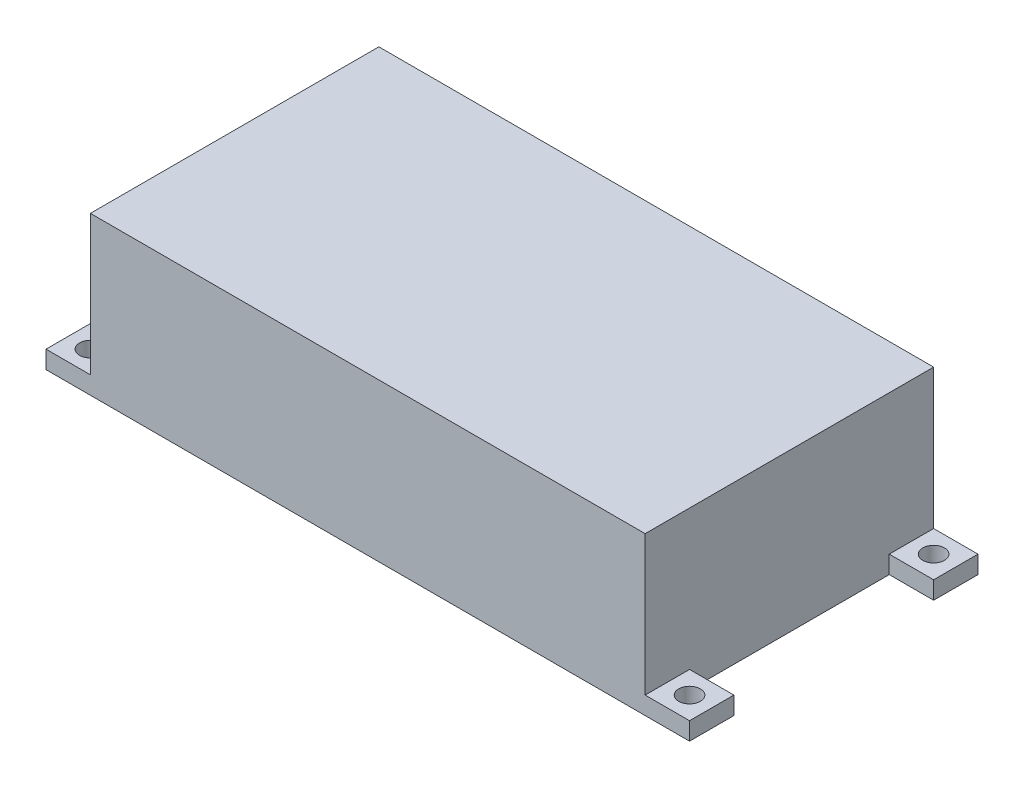
ISO-10303-21;
HEADER;
FILE_DESCRIPTION(('STEP AP214'),'2;1');
FILE_NAME('part.step','',(''),(''),'','','');
FILE_SCHEMA(('AUTOMOTIVE_DESIGN { 1 0 10303 214 1 1 1 1 }'));
ENDSEC;
DATA;
#1=APPLICATION_CONTEXT('core data for automotive mechanical design processes');
#2=APPLICATION_PROTOCOL_DEFINITION('international standard','automotive_design',2000,#1);
#3=PRODUCT_CONTEXT('',#1,'mechanical');
#4=PRODUCT('Part','Part','',(#3));
#5=PRODUCT_RELATED_PRODUCT_CATEGORY('part','',(#4));
#6=PRODUCT_DEFINITION_FORMATION('','',#4);
#7=PRODUCT_DEFINITION_CONTEXT('part definition',#1,'design');
#8=PRODUCT_DEFINITION('design','',#6,#7);
#9=PRODUCT_DEFINITION_SHAPE('','',#8);
#10=(LENGTH_UNIT() NAMED_UNIT(*) SI_UNIT(.MILLI.,.METRE.));
#11=(NAMED_UNIT(*) PLANE_ANGLE_UNIT() SI_UNIT($,.RADIAN.));
#12=(NAMED_UNIT(*) SI_UNIT($,.STERADIAN.) SOLID_ANGLE_UNIT());
#13=UNCERTAINTY_MEASURE_WITH_UNIT(LENGTH_MEASURE(1.E-05),#10,'distance_accuracy_value','');
#14=(GEOMETRIC_REPRESENTATION_CONTEXT(3) GLOBAL_UNCERTAINTY_ASSIGNED_CONTEXT((#13)) GLOBAL_UNIT_ASSIGNED_CONTEXT((#10,
#11,#12)) REPRESENTATION_CONTEXT('',''));
#15=CARTESIAN_POINT('',(0.,0.,0.));
#16=DIRECTION('',(0.,0.,1.));
#17=DIRECTION('',(1.,0.,0.));
#18=AXIS2_PLACEMENT_3D('',#15,#16,#17);
#19=CARTESIAN_POINT('',(-1.5875,20.955,-39.6875));
#20=DIRECTION('',(1.,0.,0.));
#21=DIRECTION('',(0.,0.,-1.));
#22=AXIS2_PLACEMENT_3D('',#19,#20,#21);
#23=PLANE('',#22);
#24=DIRECTION('',(0.,-1.,0.));
#25=VECTOR('',#24,1.);
#26=CARTESIAN_POINT('',(-1.5875,20.955,-39.6875));
#27=LINE('',#26,#25);
#28=CARTESIAN_POINT('',(-1.5875,22.5425,-39.6875));
#29=VERTEX_POINT('',#28);
#30=CARTESIAN_POINT('',(-1.5875,2.54,-39.6875));
#31=VERTEX_POINT('',#30);
#32=EDGE_CURVE('E384',#29,#31,#27,.T.);
#33=ORIENTED_EDGE('',*,*,#32,.T.);
#34=DIRECTION('',(0.,0.,1.));
#35=VECTOR('',#34,1.);
#36=CARTESIAN_POINT('',(-1.58750000000001,2.54,-39.6875));
#37=LINE('',#36,#35);
#38=CARTESIAN_POINT('',(-1.5875,2.54,-33.3375));
#39=VERTEX_POINT('',#38);
#40=EDGE_CURVE('E59',#31,#39,#37,.T.);
#41=ORIENTED_EDGE('',*,*,#40,.T.);
#42=DIRECTION('',(0.,-1.,0.));
#43=VECTOR('',#42,1.);
#44=CARTESIAN_POINT('',(-1.58750000000001,2.54,-33.3375));
#45=LINE('',#44,#43);
#46=CARTESIAN_POINT('',(-1.5875,0.,-33.3375));
#47=VERTEX_POINT('',#46);
#48=EDGE_CURVE('E244',#39,#47,#45,.T.);
#49=ORIENTED_EDGE('',*,*,#48,.T.);
#50=DIRECTION('',(0.,0.,1.));
#51=VECTOR('',#50,1.);
#52=CARTESIAN_POINT('',(-1.5875,0.,-39.6875));
#53=LINE('',#52,#51);
#54=CARTESIAN_POINT('',(-1.58749999999996,0.,-4.76250000000001));
#55=VERTEX_POINT('',#54);
#56=EDGE_CURVE('E378',#47,#55,#53,.T.);
#57=ORIENTED_EDGE('',*,*,#56,.T.);
#58=DIRECTION('',(0.,-1.,0.));
#59=VECTOR('',#58,1.);
#60=CARTESIAN_POINT('',(-1.58749999999996,2.54,-4.76250000000001));
#61=LINE('',#60,#59);
#62=CARTESIAN_POINT('',(-1.58749999999996,2.54,-4.76250000000001));
#63=VERTEX_POINT('',#62);
#64=EDGE_CURVE('E277',#63,#55,#61,.T.);
#65=ORIENTED_EDGE('',*,*,#64,.F.);
#66=DIRECTION('',(0.,0.,1.));
#67=VECTOR('',#66,1.);
#68=CARTESIAN_POINT('',(-1.58749999999996,2.54,1.58749999999999));
#69=LINE('',#68,#67);
#70=CARTESIAN_POINT('',(-1.5875,2.54,1.5875));
#71=VERTEX_POINT('',#70);
#72=EDGE_CURVE('E259',#63,#71,#69,.T.);
#73=ORIENTED_EDGE('',*,*,#72,.T.);
#74=DIRECTION('',(0.,-1.,0.));
#75=VECTOR('',#74,1.);
#76=CARTESIAN_POINT('',(-1.5875,20.955,1.5875));
#77=LINE('',#76,#75);
#78=CARTESIAN_POINT('',(-1.5875,22.5425,1.5875));
#79=VERTEX_POINT('',#78);
#80=EDGE_CURVE('E11',#79,#71,#77,.T.);
#81=ORIENTED_EDGE('',*,*,#80,.F.);
#82=DIRECTION('',(0.,0.,1.));
#83=VECTOR('',#82,1.);
#84=CARTESIAN_POINT('',(-1.5875,22.5425,-39.6875));
#85=LINE('',#84,#83);
#86=EDGE_CURVE('E342',#29,#79,#85,.T.);
#87=ORIENTED_EDGE('',*,*,#86,.F.);
#88=EDGE_LOOP('',(#33,#41,#49,#57,#65,#73,#81,#87));
#89=FACE_BOUND('',#88,.T.);
#90=ADVANCED_FACE('F37',(#89),#23,.F.);
#91=CARTESIAN_POINT('',(77.7875,20.955,-39.6875));
#92=DIRECTION('',(-1.,0.,0.));
#93=DIRECTION('',(0.,0.,1.));
#94=AXIS2_PLACEMENT_3D('',#91,#92,#93);
#95=PLANE('',#94);
#96=DIRECTION('',(0.,0.,-1.));
#97=VECTOR('',#96,1.);
#98=CARTESIAN_POINT('',(77.7875,2.54,1.58750000000001));
#99=LINE('',#98,#97);
#100=CARTESIAN_POINT('',(77.7875,2.54,1.5875));
#101=VERTEX_POINT('',#100);
#102=CARTESIAN_POINT('',(77.7875,2.54,-4.7625));
#103=VERTEX_POINT('',#102);
#104=EDGE_CURVE('E294',#101,#103,#99,.T.);
#105=ORIENTED_EDGE('',*,*,#104,.T.);
#106=DIRECTION('',(0.,-1.,0.));
#107=VECTOR('',#106,1.);
#108=CARTESIAN_POINT('',(77.7875,2.54,-4.7625));
#109=LINE('',#108,#107);
#110=CARTESIAN_POINT('',(77.7875,0.,-4.7625));
#111=VERTEX_POINT('',#110);
#112=EDGE_CURVE('E303',#103,#111,#109,.T.);
#113=ORIENTED_EDGE('',*,*,#112,.T.);
#114=DIRECTION('',(0.,0.,-1.));
#115=VECTOR('',#114,1.);
#116=CARTESIAN_POINT('',(77.7875,0.,-39.6875));
#117=LINE('',#116,#115);
#118=CARTESIAN_POINT('',(77.7875,0.,-33.3375));
#119=VERTEX_POINT('',#118);
#120=EDGE_CURVE('E209',#111,#119,#117,.T.);
#121=ORIENTED_EDGE('',*,*,#120,.T.);
#122=DIRECTION('',(0.,-1.,0.));
#123=VECTOR('',#122,1.);
#124=CARTESIAN_POINT('',(77.7875,2.54,-33.3375));
#125=LINE('',#124,#123);
#126=CARTESIAN_POINT('',(77.7875,2.54,-33.3375));
#127=VERTEX_POINT('',#126);
#128=EDGE_CURVE('E339',#127,#119,#125,.T.);
#129=ORIENTED_EDGE('',*,*,#128,.F.);
#130=DIRECTION('',(0.,0.,-1.));
#131=VECTOR('',#130,1.);
#132=CARTESIAN_POINT('',(77.7875,2.54,-39.6875));
#133=LINE('',#132,#131);
#134=CARTESIAN_POINT('',(77.7875,2.54,-39.6875));
#135=VERTEX_POINT('',#134);
#136=EDGE_CURVE('E321',#127,#135,#133,.T.);
#137=ORIENTED_EDGE('',*,*,#136,.T.);
#138=DIRECTION('',(0.,-1.,0.));
#139=VECTOR('',#138,1.);
#140=CARTESIAN_POINT('',(77.7875,20.955,-39.6875));
#141=LINE('',#140,#139);
#142=CARTESIAN_POINT('',(77.7875,22.5425,-39.6875));
#143=VERTEX_POINT('',#142);
#144=EDGE_CURVE('E386',#143,#135,#141,.T.);
#145=ORIENTED_EDGE('',*,*,#144,.F.);
#146=DIRECTION('',(0.,0.,-1.));
#147=VECTOR('',#146,1.);
#148=CARTESIAN_POINT('',(77.7875,22.5425,-39.6875));
#149=LINE('',#148,#147);
#150=CARTESIAN_POINT('',(77.7875,22.5425,1.5875));
#151=VERTEX_POINT('',#150);
#152=EDGE_CURVE('E352',#151,#143,#149,.T.);
#153=ORIENTED_EDGE('',*,*,#152,.F.);
#154=DIRECTION('',(0.,-1.,0.));
#155=VECTOR('',#154,1.);
#156=CARTESIAN_POINT('',(77.7875,20.955,1.5875));
#157=LINE('',#156,#155);
#158=EDGE_CURVE('E44',#151,#101,#157,.T.);
#159=ORIENTED_EDGE('',*,*,#158,.T.);
#160=EDGE_LOOP('',(#105,#113,#121,#129,#137,#145,#153,#159));
#161=FACE_BOUND('',#160,.T.);
#162=ADVANCED_FACE('F391',(#161),#95,.F.);
#163=CARTESIAN_POINT('',(0.,0.,0.));
#164=DIRECTION('',(0.,1.,0.));
#165=DIRECTION('',(0.,0.,1.));
#166=AXIS2_PLACEMENT_3D('',#163,#164,#165);
#167=PLANE('',#166);
#168=DIRECTION('',(-1.,0.,0.));
#169=VECTOR('',#168,1.);
#170=CARTESIAN_POINT('',(0.,0.,-38.1));
#171=LINE('',#170,#169);
#172=CARTESIAN_POINT('',(76.2,0.,-38.1));
#173=VERTEX_POINT('',#172);
#174=CARTESIAN_POINT('',(7.3025,0.,-38.1));
#175=VERTEX_POINT('',#174);
#176=EDGE_CURVE('E359',#173,#175,#171,.T.);
#177=ORIENTED_EDGE('',*,*,#176,.T.);
#178=DIRECTION('',(0.,0.,1.));
#179=VECTOR('',#178,1.);
#180=CARTESIAN_POINT('',(7.3025,0.,-39.6875));
#181=LINE('',#180,#179);
#182=CARTESIAN_POINT('',(7.3025,0.,-39.6875));
#183=VERTEX_POINT('',#182);
#184=EDGE_CURVE('E215',#183,#175,#181,.T.);
#185=ORIENTED_EDGE('',*,*,#184,.F.);
#186=DIRECTION('',(-1.,0.,0.));
#187=VECTOR('',#186,1.);
#188=CARTESIAN_POINT('',(-1.5875,0.,-39.6875));
#189=LINE('',#188,#187);
#190=CARTESIAN_POINT('',(84.1375,0.,-39.6875));
#191=VERTEX_POINT('',#190);
#192=EDGE_CURVE('E208',#191,#183,#189,.T.);
#193=ORIENTED_EDGE('',*,*,#192,.F.);
#194=DIRECTION('',(0.,0.,1.));
#195=VECTOR('',#194,1.);
#196=CARTESIAN_POINT('',(84.1375,0.,-39.6875));
#197=LINE('',#196,#195);
#198=CARTESIAN_POINT('',(84.1375,0.,-33.3375));
#199=VERTEX_POINT('',#198);
#200=EDGE_CURVE('E318',#191,#199,#197,.T.);
#201=ORIENTED_EDGE('',*,*,#200,.T.);
#202=DIRECTION('',(-1.,0.,0.));
#203=VECTOR('',#202,1.);
#204=CARTESIAN_POINT('',(77.7875,0.,-33.3375));
#205=LINE('',#204,#203);
#206=EDGE_CURVE('E325',#199,#119,#205,.T.);
#207=ORIENTED_EDGE('',*,*,#206,.T.);
#208=ORIENTED_EDGE('',*,*,#120,.F.);
#209=DIRECTION('',(1.,0.,0.));
#210=VECTOR('',#209,1.);
#211=CARTESIAN_POINT('',(77.7875,0.,-4.7625));
#212=LINE('',#211,#210);
#213=CARTESIAN_POINT('',(84.1374999999999,0.,-4.7625));
#214=VERTEX_POINT('',#213);
#215=EDGE_CURVE('E288',#111,#214,#212,.T.);
#216=ORIENTED_EDGE('',*,*,#215,.T.);
#217=DIRECTION('',(0.,0.,1.));
#218=VECTOR('',#217,1.);
#219=CARTESIAN_POINT('',(84.1374999999999,0.,1.58750000000001));
#220=LINE('',#219,#218);
#221=CARTESIAN_POINT('',(84.1374999999999,0.,1.58750000000001));
#222=VERTEX_POINT('',#221);
#223=EDGE_CURVE('E295',#214,#222,#220,.T.);
#224=ORIENTED_EDGE('',*,*,#223,.T.);
#225=DIRECTION('',(1.,0.,0.));
#226=VECTOR('',#225,1.);
#227=CARTESIAN_POINT('',(-1.5875,0.,1.5875));
#228=LINE('',#227,#226);
#229=CARTESIAN_POINT('',(-7.93749999999996,0.,1.58749999999999));
#230=VERTEX_POINT('',#229);
#231=EDGE_CURVE('E380',#230,#222,#228,.T.);
#232=ORIENTED_EDGE('',*,*,#231,.F.);
#233=DIRECTION('',(0.,0.,-1.));
#234=VECTOR('',#233,1.);
#235=CARTESIAN_POINT('',(-7.93749999999996,0.,1.58749999999999));
#236=LINE('',#235,#234);
#237=CARTESIAN_POINT('',(-7.93749999999996,0.,-4.76250000000001));
#238=VERTEX_POINT('',#237);
#239=EDGE_CURVE('E256',#230,#238,#236,.T.);
#240=ORIENTED_EDGE('',*,*,#239,.T.);
#241=DIRECTION('',(1.,0.,0.));
#242=VECTOR('',#241,1.);
#243=CARTESIAN_POINT('',(-1.58749999999996,0.,-4.76250000000001));
#244=LINE('',#243,#242);
#245=EDGE_CURVE('E263',#238,#55,#244,.T.);
#246=ORIENTED_EDGE('',*,*,#245,.T.);
#247=ORIENTED_EDGE('',*,*,#56,.F.);
#248=DIRECTION('',(-1.,0.,0.));
#249=VECTOR('',#248,1.);
#250=CARTESIAN_POINT('',(-1.58750000000001,0.,-33.3375));
#251=LINE('',#250,#249);
#252=CARTESIAN_POINT('',(-7.9375,0.,-33.3375));
#253=VERTEX_POINT('',#252);
#254=EDGE_CURVE('E232',#47,#253,#251,.T.);
#255=ORIENTED_EDGE('',*,*,#254,.T.);
#256=DIRECTION('',(0.,0.,-1.));
#257=VECTOR('',#256,1.);
#258=CARTESIAN_POINT('',(-7.9375,0.,-39.6875));
#259=LINE('',#258,#257);
#260=CARTESIAN_POINT('',(-7.9375,0.,-39.6875));
#261=VERTEX_POINT('',#260);
#262=EDGE_CURVE('E205',#253,#261,#259,.T.);
#263=ORIENTED_EDGE('',*,*,#262,.T.);
#264=CARTESIAN_POINT('',(0.,0.,-39.6875));
#265=VERTEX_POINT('',#264);
#266=EDGE_CURVE('E199',#265,#261,#189,.T.);
#267=ORIENTED_EDGE('',*,*,#266,.F.);
#268=DIRECTION('',(0.,0.,1.));
#269=VECTOR('',#268,1.);
#270=CARTESIAN_POINT('',(0.,0.,0.));
#271=LINE('',#270,#269);
#272=CARTESIAN_POINT('',(0.,0.,0.));
#273=VERTEX_POINT('',#272);
#274=EDGE_CURVE('E186',#265,#273,#271,.T.);
#275=ORIENTED_EDGE('',*,*,#274,.T.);
#276=DIRECTION('',(1.,0.,0.));
#277=VECTOR('',#276,1.);
#278=CARTESIAN_POINT('',(0.,0.,0.));
#279=LINE('',#278,#277);
#280=CARTESIAN_POINT('',(76.2,0.,0.));
#281=VERTEX_POINT('',#280);
#282=EDGE_CURVE('E195',#273,#281,#279,.T.);
#283=ORIENTED_EDGE('',*,*,#282,.T.);
#284=DIRECTION('',(0.,0.,-1.));
#285=VECTOR('',#284,1.);
#286=CARTESIAN_POINT('',(76.2,0.,0.));
#287=LINE('',#286,#285);
#288=EDGE_CURVE('E370',#281,#173,#287,.T.);
#289=ORIENTED_EDGE('',*,*,#288,.T.);
#290=EDGE_LOOP('',(#177,#185,#193,#201,#207,#208,#216,#224,#232,#240,#246,#247,#255,#263,#267,
#275,#283,#289));
#291=FACE_BOUND('',#290,.T.);
#292=CARTESIAN_POINT('',(80.9625,0.,-36.5125));
#293=DIRECTION('',(0.,-1.,0.));
#294=DIRECTION('',(0.,0.,-1.));
#295=AXIS2_PLACEMENT_3D('',#292,#293,#294);
#296=CIRCLE('',#295,1.54999999999999);
#297=CARTESIAN_POINT('',(80.9625,0.,-38.0625));
#298=VERTEX_POINT('',#297);
#299=EDGE_CURVE('E311',#298,#298,#296,.T.);
#300=ORIENTED_EDGE('',*,*,#299,.F.);
#301=EDGE_LOOP('',(#300));
#302=FACE_BOUND('',#301,.T.);
#303=CARTESIAN_POINT('',(80.9624999999999,0.,-1.58749999999999));
#304=DIRECTION('',(0.,-1.,0.));
#305=DIRECTION('',(0.,0.,1.));
#306=AXIS2_PLACEMENT_3D('',#303,#304,#305);
#307=CIRCLE('',#306,1.54999999999999);
#308=CARTESIAN_POINT('',(80.9624999999999,0.,-0.0374999999999985));
#309=VERTEX_POINT('',#308);
#310=EDGE_CURVE('E280',#309,#309,#307,.T.);
#311=ORIENTED_EDGE('',*,*,#310,.F.);
#312=EDGE_LOOP('',(#311));
#313=FACE_BOUND('',#312,.T.);
#314=CARTESIAN_POINT('',(-4.76249999999996,0.,-1.58750000000001));
#315=DIRECTION('',(0.,-1.,0.));
#316=DIRECTION('',(0.,0.,-1.));
#317=AXIS2_PLACEMENT_3D('',#314,#315,#316);
#318=CIRCLE('',#317,1.54999999999999);
#319=CARTESIAN_POINT('',(-4.76249999999996,0.,-3.1375));
#320=VERTEX_POINT('',#319);
#321=EDGE_CURVE('E249',#320,#320,#318,.T.);
#322=ORIENTED_EDGE('',*,*,#321,.F.);
#323=EDGE_LOOP('',(#322));
#324=FACE_BOUND('',#323,.T.);
#325=CARTESIAN_POINT('',(-4.7625,0.,-36.5125));
#326=DIRECTION('',(0.,-1.,0.));
#327=DIRECTION('',(0.,0.,1.));
#328=AXIS2_PLACEMENT_3D('',#325,#326,#327);
#329=CIRCLE('',#328,1.54999999999999);
#330=CARTESIAN_POINT('',(-4.7625,0.,-34.9625));
#331=VERTEX_POINT('',#330);
#332=EDGE_CURVE('E227',#331,#331,#329,.T.);
#333=ORIENTED_EDGE('',*,*,#332,.F.);
#334=EDGE_LOOP('',(#333));
#335=FACE_BOUND('',#334,.T.);
#336=ADVANCED_FACE('F201',(#291,#302,#313,#324,#335),#167,.F.);
#337=CARTESIAN_POINT('',(-1.5875,20.955,1.5875));
#338=DIRECTION('',(0.,0.,-1.));
#339=DIRECTION('',(-1.,0.,0.));
#340=AXIS2_PLACEMENT_3D('',#337,#338,#339);
#341=PLANE('',#340);
#342=ORIENTED_EDGE('',*,*,#231,.T.);
#343=DIRECTION('',(0.,-1.,0.));
#344=VECTOR('',#343,1.);
#345=CARTESIAN_POINT('',(84.1374999999999,2.54,1.58750000000001));
#346=LINE('',#345,#344);
#347=CARTESIAN_POINT('',(84.1374999999999,2.54,1.58750000000001));
#348=VERTEX_POINT('',#347);
#349=EDGE_CURVE('E308',#348,#222,#346,.T.);
#350=ORIENTED_EDGE('',*,*,#349,.F.);
#351=DIRECTION('',(-1.,0.,0.));
#352=VECTOR('',#351,1.);
#353=CARTESIAN_POINT('',(77.7875,2.54,1.58750000000001));
#354=LINE('',#353,#352);
#355=EDGE_CURVE('E291',#348,#101,#354,.T.);
#356=ORIENTED_EDGE('',*,*,#355,.T.);
#357=ORIENTED_EDGE('',*,*,#158,.F.);
#358=DIRECTION('',(1.,0.,0.));
#359=VECTOR('',#358,1.);
#360=CARTESIAN_POINT('',(-1.5875,22.5425,1.5875));
#361=LINE('',#360,#359);
#362=EDGE_CURVE('E349',#79,#151,#361,.T.);
#363=ORIENTED_EDGE('',*,*,#362,.F.);
#364=ORIENTED_EDGE('',*,*,#80,.T.);
#365=DIRECTION('',(-1.,0.,0.));
#366=VECTOR('',#365,1.);
#367=CARTESIAN_POINT('',(-1.58749999999996,2.54,1.58749999999999));
#368=LINE('',#367,#366);
#369=CARTESIAN_POINT('',(-7.93749999999996,2.54,1.58749999999999));
#370=VERTEX_POINT('',#369);
#371=EDGE_CURVE('E262',#71,#370,#368,.T.);
#372=ORIENTED_EDGE('',*,*,#371,.T.);
#373=DIRECTION('',(0.,-1.,0.));
#374=VECTOR('',#373,1.);
#375=CARTESIAN_POINT('',(-7.93749999999996,2.54,1.58749999999999));
#376=LINE('',#375,#374);
#377=EDGE_CURVE('E272',#370,#230,#376,.T.);
#378=ORIENTED_EDGE('',*,*,#377,.T.);
#379=EDGE_LOOP('',(#342,#350,#356,#357,#363,#364,#372,#378));
#380=FACE_BOUND('',#379,.T.);
#381=ADVANCED_FACE('F400',(#380),#341,.F.);
#382=CARTESIAN_POINT('',(-1.5875,20.955,-39.6875));
#383=DIRECTION('',(0.,0.,1.));
#384=DIRECTION('',(1.,0.,0.));
#385=AXIS2_PLACEMENT_3D('',#382,#383,#384);
#386=PLANE('',#385);
#387=DIRECTION('',(1.,0.,0.));
#388=VECTOR('',#387,1.);
#389=CARTESIAN_POINT('',(-1.58750000000001,2.54,-39.6875));
#390=LINE('',#389,#388);
#391=CARTESIAN_POINT('',(-7.9375,2.54,-39.6875));
#392=VERTEX_POINT('',#391);
#393=EDGE_CURVE('E235',#392,#31,#390,.T.);
#394=ORIENTED_EDGE('',*,*,#393,.T.);
#395=ORIENTED_EDGE('',*,*,#32,.F.);
#396=DIRECTION('',(-1.,0.,0.));
#397=VECTOR('',#396,1.);
#398=CARTESIAN_POINT('',(-1.5875,22.5425,-39.6875));
#399=LINE('',#398,#397);
#400=EDGE_CURVE('E196',#143,#29,#399,.T.);
#401=ORIENTED_EDGE('',*,*,#400,.F.);
#402=ORIENTED_EDGE('',*,*,#144,.T.);
#403=DIRECTION('',(1.,0.,0.));
#404=VECTOR('',#403,1.);
#405=CARTESIAN_POINT('',(77.7875,2.54,-39.6875));
#406=LINE('',#405,#404);
#407=CARTESIAN_POINT('',(84.1375,2.54,-39.6875));
#408=VERTEX_POINT('',#407);
#409=EDGE_CURVE('E324',#135,#408,#406,.T.);
#410=ORIENTED_EDGE('',*,*,#409,.T.);
#411=DIRECTION('',(0.,-1.,0.));
#412=VECTOR('',#411,1.);
#413=CARTESIAN_POINT('',(84.1375,2.54,-39.6875));
#414=LINE('',#413,#412);
#415=EDGE_CURVE('E334',#408,#191,#414,.T.);
#416=ORIENTED_EDGE('',*,*,#415,.T.);
#417=ORIENTED_EDGE('',*,*,#192,.T.);
#418=DIRECTION('',(0.,-1.,0.));
#419=VECTOR('',#418,1.);
#420=CARTESIAN_POINT('',(7.3025,29.9856287848632,-39.6875));
#421=LINE('',#420,#419);
#422=CARTESIAN_POINT('',(7.3025,20.955,-39.6875));
#423=VERTEX_POINT('',#422);
#424=EDGE_CURVE('E220',#423,#183,#421,.T.);
#425=ORIENTED_EDGE('',*,*,#424,.F.);
#426=DIRECTION('',(1.,0.,0.));
#427=VECTOR('',#426,1.);
#428=CARTESIAN_POINT('',(-1.5875,20.955,-39.6875));
#429=LINE('',#428,#427);
#430=CARTESIAN_POINT('',(0.,20.955,-39.6875));
#431=VERTEX_POINT('',#430);
#432=EDGE_CURVE('E214',#431,#423,#429,.T.);
#433=ORIENTED_EDGE('',*,*,#432,.F.);
#434=DIRECTION('',(0.,-1.,0.));
#435=VECTOR('',#434,1.);
#436=CARTESIAN_POINT('',(0.,22.5445,-39.6875));
#437=LINE('',#436,#435);
#438=EDGE_CURVE('E190',#431,#265,#437,.T.);
#439=ORIENTED_EDGE('',*,*,#438,.T.);
#440=ORIENTED_EDGE('',*,*,#266,.T.);
#441=DIRECTION('',(0.,-1.,0.));
#442=VECTOR('',#441,1.);
#443=CARTESIAN_POINT('',(-7.9375,2.54,-39.6875));
#444=LINE('',#443,#442);
#445=EDGE_CURVE('E247',#392,#261,#444,.T.);
#446=ORIENTED_EDGE('',*,*,#445,.F.);
#447=EDGE_LOOP('',(#394,#395,#401,#402,#410,#416,#417,#425,#433,#439,#440,#446));
#448=FACE_BOUND('',#447,.T.);
#449=ADVANCED_FACE('F212',(#448),#386,.F.);
#450=CARTESIAN_POINT('',(0.,20.955,0.));
#451=DIRECTION('',(1.,0.,0.));
#452=DIRECTION('',(0.,0.,-1.));
#453=AXIS2_PLACEMENT_3D('',#450,#451,#452);
#454=PLANE('',#453);
#455=ORIENTED_EDGE('',*,*,#274,.F.);
#456=ORIENTED_EDGE('',*,*,#438,.F.);
#457=DIRECTION('',(0.,0.,1.));
#458=VECTOR('',#457,1.);
#459=CARTESIAN_POINT('',(0.,20.955,0.));
#460=LINE('',#459,#458);
#461=CARTESIAN_POINT('',(0.,20.955,0.));
#462=VERTEX_POINT('',#461);
#463=EDGE_CURVE('E51',#431,#462,#460,.T.);
#464=ORIENTED_EDGE('',*,*,#463,.T.);
#465=DIRECTION('',(0.,-1.,0.));
#466=VECTOR('',#465,1.);
#467=CARTESIAN_POINT('',(0.,20.955,0.));
#468=LINE('',#467,#466);
#469=EDGE_CURVE('E192',#462,#273,#468,.T.);
#470=ORIENTED_EDGE('',*,*,#469,.T.);
#471=EDGE_LOOP('',(#455,#456,#464,#470));
#472=FACE_BOUND('',#471,.T.);
#473=ADVANCED_FACE('F188',(#472),#454,.T.);
#474=CARTESIAN_POINT('',(0.,20.955,0.));
#475=DIRECTION('',(0.,0.,-1.));
#476=DIRECTION('',(-1.,0.,0.));
#477=AXIS2_PLACEMENT_3D('',#474,#475,#476);
#478=PLANE('',#477);
#479=ORIENTED_EDGE('',*,*,#282,.F.);
#480=ORIENTED_EDGE('',*,*,#469,.F.);
#481=DIRECTION('',(1.,0.,0.));
#482=VECTOR('',#481,1.);
#483=CARTESIAN_POINT('',(0.,20.955,0.));
#484=LINE('',#483,#482);
#485=CARTESIAN_POINT('',(76.2,20.955,0.));
#486=VERTEX_POINT('',#485);
#487=EDGE_CURVE('E358',#462,#486,#484,.T.);
#488=ORIENTED_EDGE('',*,*,#487,.T.);
#489=DIRECTION('',(0.,-1.,0.));
#490=VECTOR('',#489,1.);
#491=CARTESIAN_POINT('',(76.2,20.955,0.));
#492=LINE('',#491,#490);
#493=EDGE_CURVE('E375',#486,#281,#492,.T.);
#494=ORIENTED_EDGE('',*,*,#493,.T.);
#495=EDGE_LOOP('',(#479,#480,#488,#494));
#496=FACE_BOUND('',#495,.T.);
#497=ADVANCED_FACE('F480',(#496),#478,.T.);
#498=CARTESIAN_POINT('',(76.2,20.955,0.));
#499=DIRECTION('',(-1.,0.,0.));
#500=DIRECTION('',(0.,0.,1.));
#501=AXIS2_PLACEMENT_3D('',#498,#499,#500);
#502=PLANE('',#501);
#503=ORIENTED_EDGE('',*,*,#288,.F.);
#504=ORIENTED_EDGE('',*,*,#493,.F.);
#505=DIRECTION('',(0.,0.,-1.));
#506=VECTOR('',#505,1.);
#507=CARTESIAN_POINT('',(76.2,20.955,0.));
#508=LINE('',#507,#506);
#509=CARTESIAN_POINT('',(76.2,20.955,-38.1));
#510=VERTEX_POINT('',#509);
#511=EDGE_CURVE('E362',#486,#510,#508,.T.);
#512=ORIENTED_EDGE('',*,*,#511,.T.);
#513=DIRECTION('',(0.,-1.,0.));
#514=VECTOR('',#513,1.);
#515=CARTESIAN_POINT('',(76.2,20.955,-38.1));
#516=LINE('',#515,#514);
#517=EDGE_CURVE('E367',#510,#173,#516,.T.);
#518=ORIENTED_EDGE('',*,*,#517,.T.);
#519=EDGE_LOOP('',(#503,#504,#512,#518));
#520=FACE_BOUND('',#519,.T.);
#521=ADVANCED_FACE('F485',(#520),#502,.T.);
#522=CARTESIAN_POINT('',(0.,20.955,-38.1));
#523=DIRECTION('',(0.,0.,1.));
#524=DIRECTION('',(1.,0.,0.));
#525=AXIS2_PLACEMENT_3D('',#522,#523,#524);
#526=PLANE('',#525);
#527=DIRECTION('',(0.,-1.,0.));
#528=VECTOR('',#527,1.);
#529=CARTESIAN_POINT('',(7.3025,29.9856287848632,-38.1));
#530=LINE('',#529,#528);
#531=CARTESIAN_POINT('',(7.3025,20.955,-38.1));
#532=VERTEX_POINT('',#531);
#533=EDGE_CURVE('E224',#532,#175,#530,.T.);
#534=ORIENTED_EDGE('',*,*,#533,.T.);
#535=ORIENTED_EDGE('',*,*,#176,.F.);
#536=ORIENTED_EDGE('',*,*,#517,.F.);
#537=DIRECTION('',(-1.,0.,0.));
#538=VECTOR('',#537,1.);
#539=CARTESIAN_POINT('',(0.,20.955,-38.1));
#540=LINE('',#539,#538);
#541=EDGE_CURVE('E365',#510,#532,#540,.T.);
#542=ORIENTED_EDGE('',*,*,#541,.T.);
#543=EDGE_LOOP('',(#534,#535,#536,#542));
#544=FACE_BOUND('',#543,.T.);
#545=ADVANCED_FACE('F491',(#544),#526,.T.);
#546=CARTESIAN_POINT('',(0.,20.955,0.));
#547=DIRECTION('',(0.,1.,0.));
#548=DIRECTION('',(0.,0.,1.));
#549=AXIS2_PLACEMENT_3D('',#546,#547,#548);
#550=PLANE('',#549);
#551=ORIENTED_EDGE('',*,*,#463,.F.);
#552=ORIENTED_EDGE('',*,*,#432,.T.);
#553=DIRECTION('',(0.,0.,1.));
#554=VECTOR('',#553,1.);
#555=CARTESIAN_POINT('',(7.3025,20.955,-39.6875));
#556=LINE('',#555,#554);
#557=EDGE_CURVE('E221',#423,#532,#556,.T.);
#558=ORIENTED_EDGE('',*,*,#557,.T.);
#559=ORIENTED_EDGE('',*,*,#541,.F.);
#560=ORIENTED_EDGE('',*,*,#511,.F.);
#561=ORIENTED_EDGE('',*,*,#487,.F.);
#562=EDGE_LOOP('',(#551,#552,#558,#559,#560,#561));
#563=FACE_BOUND('',#562,.T.);
#564=ADVANCED_FACE('F495',(#563),#550,.F.);
#565=CARTESIAN_POINT('',(0.,22.5425,0.));
#566=DIRECTION('',(0.,1.,0.));
#567=DIRECTION('',(0.,0.,1.));
#568=AXIS2_PLACEMENT_3D('',#565,#566,#567);
#569=PLANE('',#568);
#570=ORIENTED_EDGE('',*,*,#86,.T.);
#571=ORIENTED_EDGE('',*,*,#362,.T.);
#572=ORIENTED_EDGE('',*,*,#152,.T.);
#573=ORIENTED_EDGE('',*,*,#400,.T.);
#574=EDGE_LOOP('',(#570,#571,#572,#573));
#575=FACE_BOUND('',#574,.T.);
#576=ADVANCED_FACE('F423',(#575),#569,.T.);
#577=CARTESIAN_POINT('',(77.7875,2.54,-33.3375));
#578=DIRECTION('',(0.,0.,1.));
#579=DIRECTION('',(1.,0.,0.));
#580=AXIS2_PLACEMENT_3D('',#577,#578,#579);
#581=PLANE('',#580);
#582=ORIENTED_EDGE('',*,*,#206,.F.);
#583=DIRECTION('',(0.,-1.,0.));
#584=VECTOR('',#583,1.);
#585=CARTESIAN_POINT('',(84.1375,2.54,-33.3375));
#586=LINE('',#585,#584);
#587=CARTESIAN_POINT('',(84.1375,2.54,-33.3375));
#588=VERTEX_POINT('',#587);
#589=EDGE_CURVE('E343',#588,#199,#586,.T.);
#590=ORIENTED_EDGE('',*,*,#589,.F.);
#591=DIRECTION('',(-1.,0.,0.));
#592=VECTOR('',#591,1.);
#593=CARTESIAN_POINT('',(77.7875,2.54,-33.3375));
#594=LINE('',#593,#592);
#595=EDGE_CURVE('E331',#588,#127,#594,.T.);
#596=ORIENTED_EDGE('',*,*,#595,.T.);
#597=ORIENTED_EDGE('',*,*,#128,.T.);
#598=EDGE_LOOP('',(#582,#590,#596,#597));
#599=FACE_BOUND('',#598,.T.);
#600=ADVANCED_FACE('F411',(#599),#581,.T.);
#601=CARTESIAN_POINT('',(84.1375,2.54,-39.6875));
#602=DIRECTION('',(1.,0.,0.));
#603=DIRECTION('',(0.,0.,-1.));
#604=AXIS2_PLACEMENT_3D('',#601,#602,#603);
#605=PLANE('',#604);
#606=ORIENTED_EDGE('',*,*,#200,.F.);
#607=ORIENTED_EDGE('',*,*,#415,.F.);
#608=DIRECTION('',(0.,0.,1.));
#609=VECTOR('',#608,1.);
#610=CARTESIAN_POINT('',(84.1375,2.54,-39.6875));
#611=LINE('',#610,#609);
#612=EDGE_CURVE('E328',#408,#588,#611,.T.);
#613=ORIENTED_EDGE('',*,*,#612,.T.);
#614=ORIENTED_EDGE('',*,*,#589,.T.);
#615=EDGE_LOOP('',(#606,#607,#613,#614));
#616=FACE_BOUND('',#615,.T.);
#617=ADVANCED_FACE('F416',(#616),#605,.T.);
#618=CARTESIAN_POINT('',(0.,2.54,0.));
#619=DIRECTION('',(0.,1.,0.));
#620=DIRECTION('',(0.,0.,1.));
#621=AXIS2_PLACEMENT_3D('',#618,#619,#620);
#622=PLANE('',#621);
#623=CARTESIAN_POINT('',(80.9625,2.54,-36.5125));
#624=DIRECTION('',(0.,-1.,0.));
#625=DIRECTION('',(0.,0.,-1.));
#626=AXIS2_PLACEMENT_3D('',#623,#624,#625);
#627=CIRCLE('',#626,1.54999999999999);
#628=CARTESIAN_POINT('',(80.9625,2.54,-38.0625));
#629=VERTEX_POINT('',#628);
#630=EDGE_CURVE('E315',#629,#629,#627,.T.);
#631=ORIENTED_EDGE('',*,*,#630,.T.);
#632=EDGE_LOOP('',(#631));
#633=FACE_BOUND('',#632,.T.);
#634=ORIENTED_EDGE('',*,*,#136,.F.);
#635=ORIENTED_EDGE('',*,*,#595,.F.);
#636=ORIENTED_EDGE('',*,*,#612,.F.);
#637=ORIENTED_EDGE('',*,*,#409,.F.);
#638=EDGE_LOOP('',(#634,#635,#636,#637));
#639=FACE_BOUND('',#638,.T.);
#640=ADVANCED_FACE('F419',(#633,#639),#622,.T.);
#641=CARTESIAN_POINT('',(80.9625,2.54,-36.5125));
#642=DIRECTION('',(0.,-1.,0.));
#643=DIRECTION('',(0.,0.,-1.));
#644=AXIS2_PLACEMENT_3D('',#641,#642,#643);
#645=CYLINDRICAL_SURFACE('',#644,1.54999999999999);
#646=ORIENTED_EDGE('',*,*,#630,.F.);
#647=EDGE_LOOP('',(#646));
#648=FACE_BOUND('',#647,.T.);
#649=ORIENTED_EDGE('',*,*,#299,.T.);
#650=EDGE_LOOP('',(#649));
#651=FACE_BOUND('',#650,.T.);
#652=ADVANCED_FACE('F504',(#648,#651),#645,.F.);
#653=CARTESIAN_POINT('',(84.1374999999999,2.54,1.58750000000001));
#654=DIRECTION('',(1.,0.,0.));
#655=DIRECTION('',(0.,0.,-1.));
#656=AXIS2_PLACEMENT_3D('',#653,#654,#655);
#657=PLANE('',#656);
#658=ORIENTED_EDGE('',*,*,#223,.F.);
#659=DIRECTION('',(0.,-1.,0.));
#660=VECTOR('',#659,1.);
#661=CARTESIAN_POINT('',(84.1374999999999,2.54,-4.7625));
#662=LINE('',#661,#660);
#663=CARTESIAN_POINT('',(84.1374999999999,2.54,-4.7625));
#664=VERTEX_POINT('',#663);
#665=EDGE_CURVE('E312',#664,#214,#662,.T.);
#666=ORIENTED_EDGE('',*,*,#665,.F.);
#667=DIRECTION('',(0.,0.,1.));
#668=VECTOR('',#667,1.);
#669=CARTESIAN_POINT('',(84.1374999999999,2.54,1.58750000000001));
#670=LINE('',#669,#668);
#671=EDGE_CURVE('E300',#664,#348,#670,.T.);
#672=ORIENTED_EDGE('',*,*,#671,.T.);
#673=ORIENTED_EDGE('',*,*,#349,.T.);
#674=EDGE_LOOP('',(#658,#666,#672,#673));
#675=FACE_BOUND('',#674,.T.);
#676=ADVANCED_FACE('F403',(#675),#657,.T.);
#677=CARTESIAN_POINT('',(77.7875,2.54,-4.7625));
#678=DIRECTION('',(0.,0.,-1.));
#679=DIRECTION('',(-1.,0.,0.));
#680=AXIS2_PLACEMENT_3D('',#677,#678,#679);
#681=PLANE('',#680);
#682=ORIENTED_EDGE('',*,*,#215,.F.);
#683=ORIENTED_EDGE('',*,*,#112,.F.);
#684=DIRECTION('',(1.,0.,0.));
#685=VECTOR('',#684,1.);
#686=CARTESIAN_POINT('',(77.7875,2.54,-4.7625));
#687=LINE('',#686,#685);
#688=EDGE_CURVE('E297',#103,#664,#687,.T.);
#689=ORIENTED_EDGE('',*,*,#688,.T.);
#690=ORIENTED_EDGE('',*,*,#665,.T.);
#691=EDGE_LOOP('',(#682,#683,#689,#690));
#692=FACE_BOUND('',#691,.T.);
#693=ADVANCED_FACE('F407',(#692),#681,.T.);
#694=CARTESIAN_POINT('',(0.,2.54,0.));
#695=DIRECTION('',(0.,1.,0.));
#696=DIRECTION('',(0.,0.,1.));
#697=AXIS2_PLACEMENT_3D('',#694,#695,#696);
#698=PLANE('',#697);
#699=CARTESIAN_POINT('',(80.9624999999999,2.54,-1.58749999999999));
#700=DIRECTION('',(0.,-1.,0.));
#701=DIRECTION('',(0.,0.,1.));
#702=AXIS2_PLACEMENT_3D('',#699,#700,#701);
#703=CIRCLE('',#702,1.54999999999999);
#704=CARTESIAN_POINT('',(80.9624999999999,2.54,-0.0374999999999985));
#705=VERTEX_POINT('',#704);
#706=EDGE_CURVE('E285',#705,#705,#703,.T.);
#707=ORIENTED_EDGE('',*,*,#706,.T.);
#708=EDGE_LOOP('',(#707));
#709=FACE_BOUND('',#708,.T.);
#710=ORIENTED_EDGE('',*,*,#355,.F.);
#711=ORIENTED_EDGE('',*,*,#671,.F.);
#712=ORIENTED_EDGE('',*,*,#688,.F.);
#713=ORIENTED_EDGE('',*,*,#104,.F.);
#714=EDGE_LOOP('',(#710,#711,#712,#713));
#715=FACE_BOUND('',#714,.T.);
#716=ADVANCED_FACE('F398',(#709,#715),#698,.T.);
#717=CARTESIAN_POINT('',(80.9624999999999,2.54,-1.58749999999999));
#718=DIRECTION('',(0.,-1.,0.));
#719=DIRECTION('',(0.,0.,-1.));
#720=AXIS2_PLACEMENT_3D('',#717,#718,#719);
#721=CYLINDRICAL_SURFACE('',#720,1.54999999999999);
#722=ORIENTED_EDGE('',*,*,#706,.F.);
#723=EDGE_LOOP('',(#722));
#724=FACE_BOUND('',#723,.T.);
#725=ORIENTED_EDGE('',*,*,#310,.T.);
#726=EDGE_LOOP('',(#725));
#727=FACE_BOUND('',#726,.T.);
#728=ADVANCED_FACE('F515',(#724,#727),#721,.F.);
#729=CARTESIAN_POINT('',(-1.58749999999996,2.54,-4.76250000000001));
#730=DIRECTION('',(0.,0.,-1.));
#731=DIRECTION('',(-1.,0.,0.));
#732=AXIS2_PLACEMENT_3D('',#729,#730,#731);
#733=PLANE('',#732);
#734=ORIENTED_EDGE('',*,*,#245,.F.);
#735=DIRECTION('',(0.,-1.,0.));
#736=VECTOR('',#735,1.);
#737=CARTESIAN_POINT('',(-7.93749999999996,2.54,-4.76250000000001));
#738=LINE('',#737,#736);
#739=CARTESIAN_POINT('',(-7.93749999999996,2.54,-4.76250000000001));
#740=VERTEX_POINT('',#739);
#741=EDGE_CURVE('E281',#740,#238,#738,.T.);
#742=ORIENTED_EDGE('',*,*,#741,.F.);
#743=DIRECTION('',(1.,0.,0.));
#744=VECTOR('',#743,1.);
#745=CARTESIAN_POINT('',(-1.58749999999996,2.54,-4.76250000000001));
#746=LINE('',#745,#744);
#747=EDGE_CURVE('E269',#740,#63,#746,.T.);
#748=ORIENTED_EDGE('',*,*,#747,.T.);
#749=ORIENTED_EDGE('',*,*,#64,.T.);
#750=EDGE_LOOP('',(#734,#742,#748,#749));
#751=FACE_BOUND('',#750,.T.);
#752=ADVANCED_FACE('F435',(#751),#733,.T.);
#753=CARTESIAN_POINT('',(-7.93749999999996,2.54,1.58749999999999));
#754=DIRECTION('',(-1.,0.,0.));
#755=DIRECTION('',(0.,0.,1.));
#756=AXIS2_PLACEMENT_3D('',#753,#754,#755);
#757=PLANE('',#756);
#758=ORIENTED_EDGE('',*,*,#239,.F.);
#759=ORIENTED_EDGE('',*,*,#377,.F.);
#760=DIRECTION('',(0.,0.,-1.));
#761=VECTOR('',#760,1.);
#762=CARTESIAN_POINT('',(-7.93749999999996,2.54,1.58749999999999));
#763=LINE('',#762,#761);
#764=EDGE_CURVE('E266',#370,#740,#763,.T.);
#765=ORIENTED_EDGE('',*,*,#764,.T.);
#766=ORIENTED_EDGE('',*,*,#741,.T.);
#767=EDGE_LOOP('',(#758,#759,#765,#766));
#768=FACE_BOUND('',#767,.T.);
#769=ADVANCED_FACE('F431',(#768),#757,.T.);
#770=CARTESIAN_POINT('',(0.,2.54,0.));
#771=DIRECTION('',(0.,1.,0.));
#772=DIRECTION('',(0.,0.,1.));
#773=AXIS2_PLACEMENT_3D('',#770,#771,#772);
#774=PLANE('',#773);
#775=CARTESIAN_POINT('',(-4.76249999999996,2.54,-1.58750000000001));
#776=DIRECTION('',(0.,-1.,0.));
#777=DIRECTION('',(0.,0.,-1.));
#778=AXIS2_PLACEMENT_3D('',#775,#776,#777);
#779=CIRCLE('',#778,1.54999999999999);
#780=CARTESIAN_POINT('',(-4.76249999999996,2.54,-3.1375));
#781=VERTEX_POINT('',#780);
#782=EDGE_CURVE('E253',#781,#781,#779,.T.);
#783=ORIENTED_EDGE('',*,*,#782,.T.);
#784=EDGE_LOOP('',(#783));
#785=FACE_BOUND('',#784,.T.);
#786=ORIENTED_EDGE('',*,*,#72,.F.);
#787=ORIENTED_EDGE('',*,*,#747,.F.);
#788=ORIENTED_EDGE('',*,*,#764,.F.);
#789=ORIENTED_EDGE('',*,*,#371,.F.);
#790=EDGE_LOOP('',(#786,#787,#788,#789));
#791=FACE_BOUND('',#790,.T.);
#792=ADVANCED_FACE('F428',(#785,#791),#774,.T.);
#793=CARTESIAN_POINT('',(-4.76249999999996,2.54,-1.58750000000001));
#794=DIRECTION('',(0.,-1.,0.));
#795=DIRECTION('',(0.,0.,-1.));
#796=AXIS2_PLACEMENT_3D('',#793,#794,#795);
#797=CYLINDRICAL_SURFACE('',#796,1.54999999999999);
#798=ORIENTED_EDGE('',*,*,#782,.F.);
#799=EDGE_LOOP('',(#798));
#800=FACE_BOUND('',#799,.T.);
#801=ORIENTED_EDGE('',*,*,#321,.T.);
#802=EDGE_LOOP('',(#801));
#803=FACE_BOUND('',#802,.T.);
#804=ADVANCED_FACE('F526',(#800,#803),#797,.F.);
#805=CARTESIAN_POINT('',(-7.9375,2.54,-39.6875));
#806=DIRECTION('',(-1.,0.,0.));
#807=DIRECTION('',(0.,0.,1.));
#808=AXIS2_PLACEMENT_3D('',#805,#806,#807);
#809=PLANE('',#808);
#810=ORIENTED_EDGE('',*,*,#262,.F.);
#811=DIRECTION('',(0.,-1.,0.));
#812=VECTOR('',#811,1.);
#813=CARTESIAN_POINT('',(-7.9375,2.54,-33.3375));
#814=LINE('',#813,#812);
#815=CARTESIAN_POINT('',(-7.9375,2.54,-33.3375));
#816=VERTEX_POINT('',#815);
#817=EDGE_CURVE('E250',#816,#253,#814,.T.);
#818=ORIENTED_EDGE('',*,*,#817,.F.);
#819=DIRECTION('',(0.,0.,-1.));
#820=VECTOR('',#819,1.);
#821=CARTESIAN_POINT('',(-7.9375,2.54,-39.6875));
#822=LINE('',#821,#820);
#823=EDGE_CURVE('E241',#816,#392,#822,.T.);
#824=ORIENTED_EDGE('',*,*,#823,.T.);
#825=ORIENTED_EDGE('',*,*,#445,.T.);
#826=EDGE_LOOP('',(#810,#818,#824,#825));
#827=FACE_BOUND('',#826,.T.);
#828=ADVANCED_FACE('F442',(#827),#809,.T.);
#829=CARTESIAN_POINT('',(-1.58750000000001,2.54,-33.3375));
#830=DIRECTION('',(0.,0.,1.));
#831=DIRECTION('',(1.,0.,0.));
#832=AXIS2_PLACEMENT_3D('',#829,#830,#831);
#833=PLANE('',#832);
#834=ORIENTED_EDGE('',*,*,#254,.F.);
#835=ORIENTED_EDGE('',*,*,#48,.F.);
#836=DIRECTION('',(-1.,0.,0.));
#837=VECTOR('',#836,1.);
#838=CARTESIAN_POINT('',(-1.58750000000001,2.54,-33.3375));
#839=LINE('',#838,#837);
#840=EDGE_CURVE('E238',#39,#816,#839,.T.);
#841=ORIENTED_EDGE('',*,*,#840,.T.);
#842=ORIENTED_EDGE('',*,*,#817,.T.);
#843=EDGE_LOOP('',(#834,#835,#841,#842));
#844=FACE_BOUND('',#843,.T.);
#845=ADVANCED_FACE('F438',(#844),#833,.T.);
#846=CARTESIAN_POINT('',(0.,2.54,0.));
#847=DIRECTION('',(0.,1.,0.));
#848=DIRECTION('',(0.,0.,1.));
#849=AXIS2_PLACEMENT_3D('',#846,#847,#848);
#850=PLANE('',#849);
#851=CARTESIAN_POINT('',(-4.7625,2.54,-36.5125));
#852=DIRECTION('',(0.,-1.,0.));
#853=DIRECTION('',(0.,0.,1.));
#854=AXIS2_PLACEMENT_3D('',#851,#852,#853);
#855=CIRCLE('',#854,1.54999999999999);
#856=CARTESIAN_POINT('',(-4.7625,2.54,-34.9625));
#857=VERTEX_POINT('',#856);
#858=EDGE_CURVE('E229',#857,#857,#855,.T.);
#859=ORIENTED_EDGE('',*,*,#858,.T.);
#860=EDGE_LOOP('',(#859));
#861=FACE_BOUND('',#860,.T.);
#862=ORIENTED_EDGE('',*,*,#393,.F.);
#863=ORIENTED_EDGE('',*,*,#823,.F.);
#864=ORIENTED_EDGE('',*,*,#840,.F.);
#865=ORIENTED_EDGE('',*,*,#40,.F.);
#866=EDGE_LOOP('',(#862,#863,#864,#865));
#867=FACE_BOUND('',#866,.T.);
#868=ADVANCED_FACE('F445',(#861,#867),#850,.T.);
#869=CARTESIAN_POINT('',(-4.7625,2.54,-36.5125));
#870=DIRECTION('',(0.,-1.,0.));
#871=DIRECTION('',(0.,0.,-1.));
#872=AXIS2_PLACEMENT_3D('',#869,#870,#871);
#873=CYLINDRICAL_SURFACE('',#872,1.54999999999999);
#874=ORIENTED_EDGE('',*,*,#858,.F.);
#875=EDGE_LOOP('',(#874));
#876=FACE_BOUND('',#875,.T.);
#877=ORIENTED_EDGE('',*,*,#332,.T.);
#878=EDGE_LOOP('',(#877));
#879=FACE_BOUND('',#878,.T.);
#880=ADVANCED_FACE('F447',(#876,#879),#873,.F.);
#881=CARTESIAN_POINT('',(7.3025,29.9856287848632,-39.6875));
#882=DIRECTION('',(1.,0.,0.));
#883=DIRECTION('',(0.,0.,-1.));
#884=AXIS2_PLACEMENT_3D('',#881,#882,#883);
#885=PLANE('',#884);
#886=ORIENTED_EDGE('',*,*,#424,.T.);
#887=ORIENTED_EDGE('',*,*,#184,.T.);
#888=ORIENTED_EDGE('',*,*,#533,.F.);
#889=ORIENTED_EDGE('',*,*,#557,.F.);
#890=EDGE_LOOP('',(#886,#887,#888,#889));
#891=FACE_BOUND('',#890,.T.);
#892=ADVANCED_FACE('F454',(#891),#885,.F.);
#893=CLOSED_SHELL('',(#90,#162,#336,#381,#449,#473,#497,#521,#545,#564,#576,#600,#617,#640,#652,
#676,#693,#716,#728,#752,#769,#792,#804,#828,#845,#868,#880,#892));
#894=MANIFOLD_SOLID_BREP('B2',#893);
#895=ADVANCED_BREP_SHAPE_REPRESENTATION('',(#18,#894),#14);
#896=SHAPE_DEFINITION_REPRESENTATION(#9,#895);
ENDSEC;
END-ISO-10303-21;
